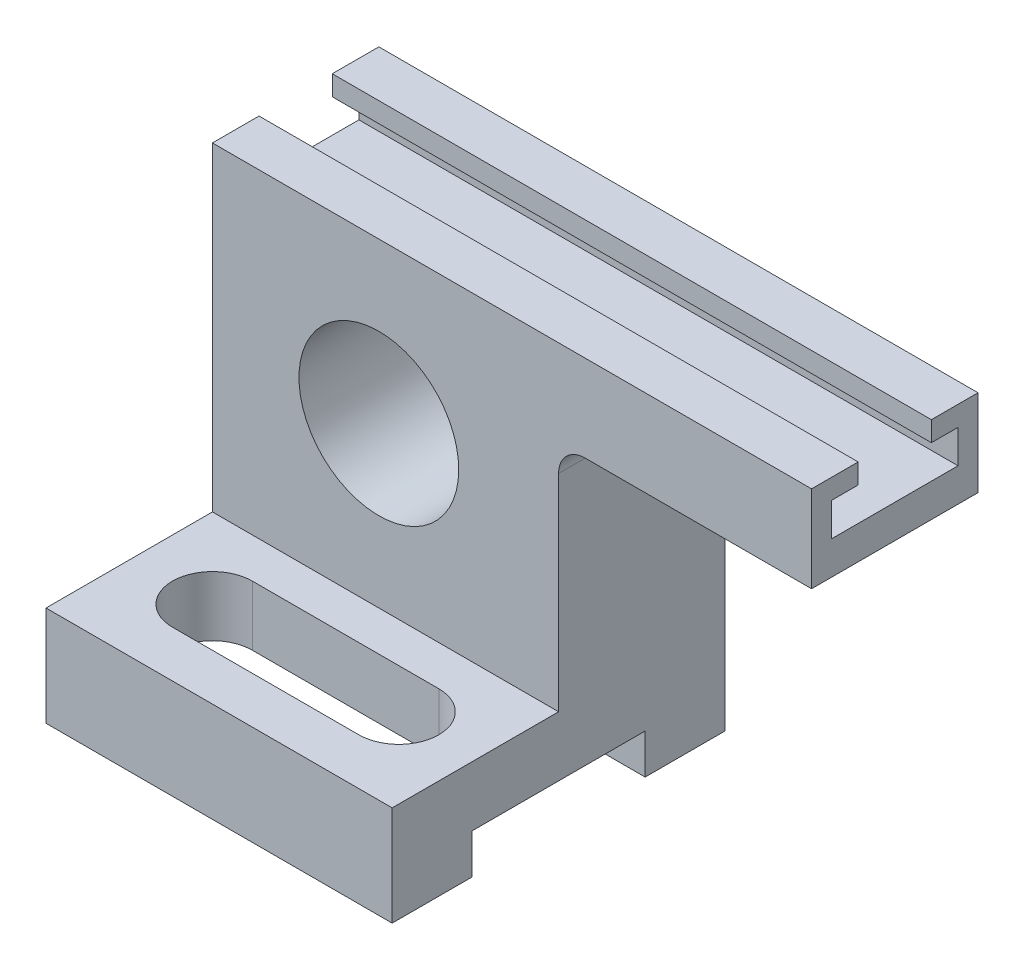
ISO-10303-21;
HEADER;
FILE_DESCRIPTION(('STEP AP214'),'2;1');
FILE_NAME('part.step','',(''),(''),'','','');
FILE_SCHEMA(('AUTOMOTIVE_DESIGN { 1 0 10303 214 1 1 1 1 }'));
ENDSEC;
DATA;
#1=APPLICATION_CONTEXT('core data for automotive mechanical design processes');
#2=APPLICATION_PROTOCOL_DEFINITION('international standard','automotive_design',2000,#1);
#3=PRODUCT_CONTEXT('',#1,'mechanical');
#4=PRODUCT('Part','Part','',(#3));
#5=PRODUCT_RELATED_PRODUCT_CATEGORY('part','',(#4));
#6=PRODUCT_DEFINITION_FORMATION('','',#4);
#7=PRODUCT_DEFINITION_CONTEXT('part definition',#1,'design');
#8=PRODUCT_DEFINITION('design','',#6,#7);
#9=PRODUCT_DEFINITION_SHAPE('','',#8);
#10=(LENGTH_UNIT() NAMED_UNIT(*) SI_UNIT(.MILLI.,.METRE.));
#11=(NAMED_UNIT(*) PLANE_ANGLE_UNIT() SI_UNIT($,.RADIAN.));
#12=(NAMED_UNIT(*) SI_UNIT($,.STERADIAN.) SOLID_ANGLE_UNIT());
#13=UNCERTAINTY_MEASURE_WITH_UNIT(LENGTH_MEASURE(1.E-05),#10,'distance_accuracy_value','');
#14=(GEOMETRIC_REPRESENTATION_CONTEXT(3) GLOBAL_UNCERTAINTY_ASSIGNED_CONTEXT((#13)) GLOBAL_UNIT_ASSIGNED_CONTEXT((#10,
#11,#12)) REPRESENTATION_CONTEXT('',''));
#15=CARTESIAN_POINT('',(0.,0.,0.));
#16=DIRECTION('',(0.,0.,1.));
#17=DIRECTION('',(1.,0.,0.));
#18=AXIS2_PLACEMENT_3D('',#15,#16,#17);
#19=CARTESIAN_POINT('',(0.,30.,100.));
#20=DIRECTION('',(0.,1.,0.));
#21=DIRECTION('',(0.,0.,1.));
#22=AXIS2_PLACEMENT_3D('',#19,#20,#21);
#23=PLANE('',#22);
#24=DIRECTION('',(1.,0.,0.));
#25=VECTOR('',#24,1.);
#26=CARTESIAN_POINT('',(0.,30.,50.));
#27=LINE('',#26,#25);
#28=CARTESIAN_POINT('',(0.,30.,50.));
#29=VERTEX_POINT('',#28);
#30=CARTESIAN_POINT('',(104.,30.,50.));
#31=VERTEX_POINT('',#30);
#32=EDGE_CURVE('E370',#29,#31,#27,.T.);
#33=ORIENTED_EDGE('',*,*,#32,.F.);
#34=DIRECTION('',(0.,0.,-1.));
#35=VECTOR('',#34,1.);
#36=CARTESIAN_POINT('',(0.,30.,100.));
#37=LINE('',#36,#35);
#38=CARTESIAN_POINT('',(0.,30.,100.));
#39=VERTEX_POINT('',#38);
#40=EDGE_CURVE('E363',#39,#29,#37,.T.);
#41=ORIENTED_EDGE('',*,*,#40,.F.);
#42=DIRECTION('',(1.,0.,0.));
#43=VECTOR('',#42,1.);
#44=CARTESIAN_POINT('',(0.,30.,100.));
#45=LINE('',#44,#43);
#46=CARTESIAN_POINT('',(104.,30.,100.));
#47=VERTEX_POINT('',#46);
#48=EDGE_CURVE('E342',#39,#47,#45,.T.);
#49=ORIENTED_EDGE('',*,*,#48,.T.);
#50=DIRECTION('',(0.,0.,-1.));
#51=VECTOR('',#50,1.);
#52=CARTESIAN_POINT('',(104.,30.,100.));
#53=LINE('',#52,#51);
#54=EDGE_CURVE('E351',#47,#31,#53,.T.);
#55=ORIENTED_EDGE('',*,*,#54,.T.);
#56=EDGE_LOOP('',(#33,#41,#49,#55));
#57=FACE_BOUND('',#56,.T.);
#58=CARTESIAN_POINT('',(24.,30.,74.));
#59=DIRECTION('',(0.,1.,0.));
#60=DIRECTION('',(0.,0.,1.));
#61=AXIS2_PLACEMENT_3D('',#58,#59,#60);
#62=CIRCLE('',#61,12.);
#63=CARTESIAN_POINT('',(24.,30.,62.));
#64=VERTEX_POINT('',#63);
#65=CARTESIAN_POINT('',(24.,30.,86.));
#66=VERTEX_POINT('',#65);
#67=EDGE_CURVE('E233',#64,#66,#62,.T.);
#68=ORIENTED_EDGE('',*,*,#67,.F.);
#69=DIRECTION('',(1.,0.,0.));
#70=VECTOR('',#69,1.);
#71=CARTESIAN_POINT('',(24.,30.,62.));
#72=LINE('',#71,#70);
#73=CARTESIAN_POINT('',(80.,30.,62.));
#74=VERTEX_POINT('',#73);
#75=EDGE_CURVE('E243',#64,#74,#72,.T.);
#76=ORIENTED_EDGE('',*,*,#75,.T.);
#77=CARTESIAN_POINT('',(80.,30.,74.));
#78=DIRECTION('',(0.,1.,0.));
#79=DIRECTION('',(0.,0.,1.));
#80=AXIS2_PLACEMENT_3D('',#77,#78,#79);
#81=CIRCLE('',#80,12.);
#82=CARTESIAN_POINT('',(80.,30.,86.));
#83=VERTEX_POINT('',#82);
#84=EDGE_CURVE('E246',#83,#74,#81,.T.);
#85=ORIENTED_EDGE('',*,*,#84,.F.);
#86=DIRECTION('',(1.,0.,0.));
#87=VECTOR('',#86,1.);
#88=CARTESIAN_POINT('',(24.,30.,86.));
#89=LINE('',#88,#87);
#90=EDGE_CURVE('E219',#66,#83,#89,.T.);
#91=ORIENTED_EDGE('',*,*,#90,.F.);
#92=EDGE_LOOP('',(#68,#76,#85,#91));
#93=FACE_BOUND('',#92,.T.);
#94=ADVANCED_FACE('F33',(#57,#93),#23,.T.);
#95=CARTESIAN_POINT('',(0.,0.,76.));
#96=DIRECTION('',(0.,0.,-1.));
#97=DIRECTION('',(-1.,0.,0.));
#98=AXIS2_PLACEMENT_3D('',#95,#96,#97);
#99=PLANE('',#98);
#100=DIRECTION('',(0.,1.,0.));
#101=VECTOR('',#100,1.);
#102=CARTESIAN_POINT('',(91.8321595661992,0.,76.));
#103=LINE('',#102,#101);
#104=CARTESIAN_POINT('',(91.8321595661992,12.,76.));
#105=VERTEX_POINT('',#104);
#106=CARTESIAN_POINT('',(91.8321595661993,0.,76.));
#107=VERTEX_POINT('',#106);
#108=EDGE_CURVE('E230',#105,#107,#103,.F.);
#109=ORIENTED_EDGE('',*,*,#108,.F.);
#110=DIRECTION('',(1.,0.,0.));
#111=VECTOR('',#110,1.);
#112=CARTESIAN_POINT('',(0.,12.,76.));
#113=LINE('',#112,#111);
#114=CARTESIAN_POINT('',(104.,12.,76.));
#115=VERTEX_POINT('',#114);
#116=EDGE_CURVE('E332',#105,#115,#113,.T.);
#117=ORIENTED_EDGE('',*,*,#116,.T.);
#118=DIRECTION('',(0.,-1.,0.));
#119=VECTOR('',#118,1.);
#120=CARTESIAN_POINT('',(104.,0.,76.));
#121=LINE('',#120,#119);
#122=CARTESIAN_POINT('',(104.,0.,76.));
#123=VERTEX_POINT('',#122);
#124=EDGE_CURVE('E338',#115,#123,#121,.T.);
#125=ORIENTED_EDGE('',*,*,#124,.T.);
#126=DIRECTION('',(1.,0.,0.));
#127=VECTOR('',#126,1.);
#128=CARTESIAN_POINT('',(0.,0.,76.));
#129=LINE('',#128,#127);
#130=EDGE_CURVE('E324',#107,#123,#129,.T.);
#131=ORIENTED_EDGE('',*,*,#130,.F.);
#132=EDGE_LOOP('',(#109,#117,#125,#131));
#133=FACE_BOUND('',#132,.T.);
#134=ADVANCED_FACE('F448',(#133),#99,.T.);
#135=CARTESIAN_POINT('',(0.,126.,50.));
#136=DIRECTION('',(0.,-1.,0.));
#137=DIRECTION('',(1.,0.,0.));
#138=AXIS2_PLACEMENT_3D('',#135,#136,#137);
#139=PLANE('',#138);
#140=DIRECTION('',(0.,0.,-1.));
#141=VECTOR('',#140,1.);
#142=CARTESIAN_POINT('',(180.,126.,50.));
#143=LINE('',#142,#141);
#144=CARTESIAN_POINT('',(180.,126.,50.));
#145=VERTEX_POINT('',#144);
#146=CARTESIAN_POINT('',(180.,126.,36.));
#147=VERTEX_POINT('',#146);
#148=EDGE_CURVE('E398',#145,#147,#143,.T.);
#149=ORIENTED_EDGE('',*,*,#148,.T.);
#150=DIRECTION('',(1.,0.,0.));
#151=VECTOR('',#150,1.);
#152=CARTESIAN_POINT('',(0.,126.,36.));
#153=LINE('',#152,#151);
#154=CARTESIAN_POINT('',(0.,126.,36.));
#155=VERTEX_POINT('',#154);
#156=EDGE_CURVE('E307',#155,#147,#153,.T.);
#157=ORIENTED_EDGE('',*,*,#156,.F.);
#158=DIRECTION('',(0.,0.,-1.));
#159=VECTOR('',#158,1.);
#160=CARTESIAN_POINT('',(0.,126.,50.));
#161=LINE('',#160,#159);
#162=CARTESIAN_POINT('',(0.,126.,50.));
#163=VERTEX_POINT('',#162);
#164=EDGE_CURVE('E394',#163,#155,#161,.T.);
#165=ORIENTED_EDGE('',*,*,#164,.F.);
#166=DIRECTION('',(-1.,0.,0.));
#167=VECTOR('',#166,1.);
#168=CARTESIAN_POINT('',(0.,126.,50.));
#169=LINE('',#168,#167);
#170=EDGE_CURVE('E380',#145,#163,#169,.T.);
#171=ORIENTED_EDGE('',*,*,#170,.F.);
#172=EDGE_LOOP('',(#149,#157,#165,#171));
#173=FACE_BOUND('',#172,.T.);
#174=ADVANCED_FACE('F454',(#173),#139,.F.);
#175=CARTESIAN_POINT('',(0.,0.,50.));
#176=DIRECTION('',(1.,0.,0.));
#177=DIRECTION('',(0.,1.,0.));
#178=AXIS2_PLACEMENT_3D('',#175,#176,#177);
#179=PLANE('',#178);
#180=ORIENTED_EDGE('',*,*,#164,.T.);
#181=DIRECTION('',(0.,-1.,0.));
#182=VECTOR('',#181,1.);
#183=CARTESIAN_POINT('',(0.,126.,36.));
#184=LINE('',#183,#182);
#185=CARTESIAN_POINT('',(0.,120.,36.));
#186=VERTEX_POINT('',#185);
#187=EDGE_CURVE('E277',#155,#186,#184,.T.);
#188=ORIENTED_EDGE('',*,*,#187,.T.);
#189=DIRECTION('',(0.,0.,1.));
#190=VECTOR('',#189,1.);
#191=CARTESIAN_POINT('',(0.,120.,36.));
#192=LINE('',#191,#190);
#193=CARTESIAN_POINT('',(0.,120.,44.));
#194=VERTEX_POINT('',#193);
#195=EDGE_CURVE('E280',#186,#194,#192,.T.);
#196=ORIENTED_EDGE('',*,*,#195,.T.);
#197=DIRECTION('',(0.,-1.,0.));
#198=VECTOR('',#197,1.);
#199=CARTESIAN_POINT('',(0.,120.,44.));
#200=LINE('',#199,#198);
#201=CARTESIAN_POINT('',(0.,110.,44.));
#202=VERTEX_POINT('',#201);
#203=EDGE_CURVE('E261',#194,#202,#200,.T.);
#204=ORIENTED_EDGE('',*,*,#203,.T.);
#205=DIRECTION('',(0.,0.,-1.));
#206=VECTOR('',#205,1.);
#207=CARTESIAN_POINT('',(0.,110.,44.));
#208=LINE('',#207,#206);
#209=CARTESIAN_POINT('',(0.,110.,6.));
#210=VERTEX_POINT('',#209);
#211=EDGE_CURVE('E264',#202,#210,#208,.T.);
#212=ORIENTED_EDGE('',*,*,#211,.T.);
#213=DIRECTION('',(0.,1.,0.));
#214=VECTOR('',#213,1.);
#215=CARTESIAN_POINT('',(0.,110.,6.));
#216=LINE('',#215,#214);
#217=CARTESIAN_POINT('',(0.,120.,6.));
#218=VERTEX_POINT('',#217);
#219=EDGE_CURVE('E268',#210,#218,#216,.T.);
#220=ORIENTED_EDGE('',*,*,#219,.T.);
#221=DIRECTION('',(0.,0.,1.));
#222=VECTOR('',#221,1.);
#223=CARTESIAN_POINT('',(0.,120.,6.));
#224=LINE('',#223,#222);
#225=CARTESIAN_POINT('',(0.,120.,14.));
#226=VERTEX_POINT('',#225);
#227=EDGE_CURVE('E271',#218,#226,#224,.T.);
#228=ORIENTED_EDGE('',*,*,#227,.T.);
#229=DIRECTION('',(0.,1.,0.));
#230=VECTOR('',#229,1.);
#231=CARTESIAN_POINT('',(0.,120.,14.));
#232=LINE('',#231,#230);
#233=CARTESIAN_POINT('',(0.,126.,14.));
#234=VERTEX_POINT('',#233);
#235=EDGE_CURVE('E274',#226,#234,#232,.T.);
#236=ORIENTED_EDGE('',*,*,#235,.T.);
#237=CARTESIAN_POINT('',(0.,126.,0.));
#238=VERTEX_POINT('',#237);
#239=EDGE_CURVE('E382',#234,#238,#161,.T.);
#240=ORIENTED_EDGE('',*,*,#239,.T.);
#241=DIRECTION('',(0.,-1.,0.));
#242=VECTOR('',#241,1.);
#243=CARTESIAN_POINT('',(0.,0.,0.));
#244=LINE('',#243,#242);
#245=CARTESIAN_POINT('',(0.,0.,0.));
#246=VERTEX_POINT('',#245);
#247=EDGE_CURVE('E366',#238,#246,#244,.T.);
#248=ORIENTED_EDGE('',*,*,#247,.T.);
#249=DIRECTION('',(0.,0.,-1.));
#250=VECTOR('',#249,1.);
#251=CARTESIAN_POINT('',(0.,0.,100.));
#252=LINE('',#251,#250);
#253=CARTESIAN_POINT('',(0.,0.,24.));
#254=VERTEX_POINT('',#253);
#255=EDGE_CURVE('E359',#254,#246,#252,.T.);
#256=ORIENTED_EDGE('',*,*,#255,.F.);
#257=DIRECTION('',(0.,-1.,0.));
#258=VECTOR('',#257,1.);
#259=CARTESIAN_POINT('',(0.,12.,24.));
#260=LINE('',#259,#258);
#261=CARTESIAN_POINT('',(0.,12.,24.));
#262=VERTEX_POINT('',#261);
#263=EDGE_CURVE('E322',#262,#254,#260,.T.);
#264=ORIENTED_EDGE('',*,*,#263,.F.);
#265=DIRECTION('',(0.,0.,-1.));
#266=VECTOR('',#265,1.);
#267=CARTESIAN_POINT('',(0.,12.,76.));
#268=LINE('',#267,#266);
#269=CARTESIAN_POINT('',(0.,12.,76.));
#270=VERTEX_POINT('',#269);
#271=EDGE_CURVE('E320',#270,#262,#268,.T.);
#272=ORIENTED_EDGE('',*,*,#271,.F.);
#273=DIRECTION('',(0.,1.,0.));
#274=VECTOR('',#273,1.);
#275=CARTESIAN_POINT('',(0.,0.,76.));
#276=LINE('',#275,#274);
#277=CARTESIAN_POINT('',(0.,0.,76.));
#278=VERTEX_POINT('',#277);
#279=EDGE_CURVE('E304',#278,#270,#276,.T.);
#280=ORIENTED_EDGE('',*,*,#279,.F.);
#281=CARTESIAN_POINT('',(0.,0.,100.));
#282=VERTEX_POINT('',#281);
#283=EDGE_CURVE('E360',#282,#278,#252,.T.);
#284=ORIENTED_EDGE('',*,*,#283,.F.);
#285=DIRECTION('',(0.,-1.,0.));
#286=VECTOR('',#285,1.);
#287=CARTESIAN_POINT('',(0.,0.,100.));
#288=LINE('',#287,#286);
#289=EDGE_CURVE('E345',#39,#282,#288,.T.);
#290=ORIENTED_EDGE('',*,*,#289,.F.);
#291=ORIENTED_EDGE('',*,*,#40,.T.);
#292=DIRECTION('',(0.,-1.,0.));
#293=VECTOR('',#292,1.);
#294=CARTESIAN_POINT('',(0.,0.,50.));
#295=LINE('',#294,#293);
#296=EDGE_CURVE('E367',#163,#29,#295,.T.);
#297=ORIENTED_EDGE('',*,*,#296,.F.);
#298=EDGE_LOOP('',(#180,#188,#196,#204,#212,#220,#228,#236,#240,#248,#256,#264,#272,#280,#284,
#290,#291,#297));
#299=FACE_BOUND('',#298,.T.);
#300=ADVANCED_FACE('F480',(#299),#179,.F.);
#301=CARTESIAN_POINT('',(104.,0.,50.));
#302=DIRECTION('',(-1.,0.,0.));
#303=DIRECTION('',(0.,0.,1.));
#304=AXIS2_PLACEMENT_3D('',#301,#302,#303);
#305=PLANE('',#304);
#306=DIRECTION('',(0.,1.,0.));
#307=VECTOR('',#306,1.);
#308=CARTESIAN_POINT('',(104.,0.,0.));
#309=LINE('',#308,#307);
#310=CARTESIAN_POINT('',(104.,0.,0.));
#311=VERTEX_POINT('',#310);
#312=CARTESIAN_POINT('',(104.,92.,0.));
#313=VERTEX_POINT('',#312);
#314=EDGE_CURVE('E385',#311,#313,#309,.T.);
#315=ORIENTED_EDGE('',*,*,#314,.T.);
#316=DIRECTION('',(0.,0.,-1.));
#317=VECTOR('',#316,1.);
#318=CARTESIAN_POINT('',(104.,92.,50.));
#319=LINE('',#318,#317);
#320=CARTESIAN_POINT('',(104.,92.,50.));
#321=VERTEX_POINT('',#320);
#322=EDGE_CURVE('E48',#313,#321,#319,.F.);
#323=ORIENTED_EDGE('',*,*,#322,.T.);
#324=DIRECTION('',(0.,1.,0.));
#325=VECTOR('',#324,1.);
#326=CARTESIAN_POINT('',(104.,0.,50.));
#327=LINE('',#326,#325);
#328=EDGE_CURVE('E374',#31,#321,#327,.T.);
#329=ORIENTED_EDGE('',*,*,#328,.F.);
#330=ORIENTED_EDGE('',*,*,#54,.F.);
#331=DIRECTION('',(0.,1.,0.));
#332=VECTOR('',#331,1.);
#333=CARTESIAN_POINT('',(104.,0.,100.));
#334=LINE('',#333,#332);
#335=CARTESIAN_POINT('',(104.,0.,100.));
#336=VERTEX_POINT('',#335);
#337=EDGE_CURVE('E349',#336,#47,#334,.T.);
#338=ORIENTED_EDGE('',*,*,#337,.F.);
#339=DIRECTION('',(0.,0.,-1.));
#340=VECTOR('',#339,1.);
#341=CARTESIAN_POINT('',(104.,0.,100.));
#342=LINE('',#341,#340);
#343=EDGE_CURVE('E356',#336,#123,#342,.T.);
#344=ORIENTED_EDGE('',*,*,#343,.T.);
#345=ORIENTED_EDGE('',*,*,#124,.F.);
#346=DIRECTION('',(0.,0.,1.));
#347=VECTOR('',#346,1.);
#348=CARTESIAN_POINT('',(104.,12.,50.));
#349=LINE('',#348,#347);
#350=CARTESIAN_POINT('',(104.,12.,24.));
#351=VERTEX_POINT('',#350);
#352=EDGE_CURVE('E404',#351,#115,#349,.T.);
#353=ORIENTED_EDGE('',*,*,#352,.F.);
#354=DIRECTION('',(0.,1.,0.));
#355=VECTOR('',#354,1.);
#356=CARTESIAN_POINT('',(104.,0.,24.));
#357=LINE('',#356,#355);
#358=CARTESIAN_POINT('',(104.,0.,24.));
#359=VERTEX_POINT('',#358);
#360=EDGE_CURVE('E336',#359,#351,#357,.T.);
#361=ORIENTED_EDGE('',*,*,#360,.F.);
#362=EDGE_CURVE('E355',#359,#311,#342,.T.);
#363=ORIENTED_EDGE('',*,*,#362,.T.);
#364=EDGE_LOOP('',(#315,#323,#329,#330,#338,#344,#345,#353,#361,#363));
#365=FACE_BOUND('',#364,.T.);
#366=ADVANCED_FACE('F478',(#365),#305,.F.);
#367=CARTESIAN_POINT('',(0.,0.,100.));
#368=DIRECTION('',(0.,1.,0.));
#369=DIRECTION('',(0.,0.,1.));
#370=AXIS2_PLACEMENT_3D('',#367,#368,#369);
#371=PLANE('',#370);
#372=DIRECTION('',(1.,0.,0.));
#373=VECTOR('',#372,1.);
#374=CARTESIAN_POINT('',(24.,0.,86.));
#375=LINE('',#374,#373);
#376=CARTESIAN_POINT('',(24.,0.,86.));
#377=VERTEX_POINT('',#376);
#378=CARTESIAN_POINT('',(80.,0.,86.));
#379=VERTEX_POINT('',#378);
#380=EDGE_CURVE('E216',#377,#379,#375,.T.);
#381=ORIENTED_EDGE('',*,*,#380,.T.);
#382=CARTESIAN_POINT('',(80.,0.,74.));
#383=DIRECTION('',(0.,1.,0.));
#384=DIRECTION('',(0.,0.,1.));
#385=AXIS2_PLACEMENT_3D('',#382,#383,#384);
#386=CIRCLE('',#385,12.);
#387=EDGE_CURVE('E227',#379,#107,#386,.T.);
#388=ORIENTED_EDGE('',*,*,#387,.T.);
#389=ORIENTED_EDGE('',*,*,#130,.T.);
#390=ORIENTED_EDGE('',*,*,#343,.F.);
#391=DIRECTION('',(1.,0.,0.));
#392=VECTOR('',#391,1.);
#393=CARTESIAN_POINT('',(0.,0.,100.));
#394=LINE('',#393,#392);
#395=EDGE_CURVE('E347',#282,#336,#394,.T.);
#396=ORIENTED_EDGE('',*,*,#395,.F.);
#397=ORIENTED_EDGE('',*,*,#283,.T.);
#398=CARTESIAN_POINT('',(12.1678404338008,0.,76.));
#399=VERTEX_POINT('',#398);
#400=EDGE_CURVE('E325',#278,#399,#129,.T.);
#401=ORIENTED_EDGE('',*,*,#400,.T.);
#402=CARTESIAN_POINT('',(24.,0.,74.));
#403=DIRECTION('',(0.,1.,0.));
#404=DIRECTION('',(0.,0.,1.));
#405=AXIS2_PLACEMENT_3D('',#402,#403,#404);
#406=CIRCLE('',#405,12.);
#407=EDGE_CURVE('E237',#399,#377,#406,.T.);
#408=ORIENTED_EDGE('',*,*,#407,.T.);
#409=EDGE_LOOP('',(#381,#388,#389,#390,#396,#397,#401,#408));
#410=FACE_BOUND('',#409,.T.);
#411=ADVANCED_FACE('F235',(#410),#371,.F.);
#412=DIRECTION('',(1.,0.,0.));
#413=VECTOR('',#412,1.);
#414=CARTESIAN_POINT('',(0.,0.,24.));
#415=LINE('',#414,#413);
#416=EDGE_CURVE('E327',#254,#359,#415,.T.);
#417=ORIENTED_EDGE('',*,*,#416,.F.);
#418=ORIENTED_EDGE('',*,*,#255,.T.);
#419=DIRECTION('',(1.,0.,0.));
#420=VECTOR('',#419,1.);
#421=CARTESIAN_POINT('',(0.,0.,0.));
#422=LINE('',#421,#420);
#423=EDGE_CURVE('E341',#246,#311,#422,.T.);
#424=ORIENTED_EDGE('',*,*,#423,.T.);
#425=ORIENTED_EDGE('',*,*,#362,.F.);
#426=EDGE_LOOP('',(#417,#418,#424,#425));
#427=FACE_BOUND('',#426,.T.);
#428=ADVANCED_FACE('F477',(#427),#371,.F.);
#429=CARTESIAN_POINT('',(0.,100.,50.));
#430=DIRECTION('',(0.,1.,0.));
#431=DIRECTION('',(0.,0.,1.));
#432=AXIS2_PLACEMENT_3D('',#429,#430,#431);
#433=PLANE('',#432);
#434=DIRECTION('',(1.,0.,0.));
#435=VECTOR('',#434,1.);
#436=CARTESIAN_POINT('',(0.,100.,50.));
#437=LINE('',#436,#435);
#438=CARTESIAN_POINT('',(112.,100.,50.));
#439=VERTEX_POINT('',#438);
#440=CARTESIAN_POINT('',(180.,100.,50.));
#441=VERTEX_POINT('',#440);
#442=EDGE_CURVE('E376',#439,#441,#437,.T.);
#443=ORIENTED_EDGE('',*,*,#442,.F.);
#444=DIRECTION('',(0.,0.,-1.));
#445=VECTOR('',#444,1.);
#446=CARTESIAN_POINT('',(112.,100.,0.));
#447=LINE('',#446,#445);
#448=CARTESIAN_POINT('',(112.,100.,0.));
#449=VERTEX_POINT('',#448);
#450=EDGE_CURVE('E413',#439,#449,#447,.T.);
#451=ORIENTED_EDGE('',*,*,#450,.T.);
#452=DIRECTION('',(1.,0.,0.));
#453=VECTOR('',#452,1.);
#454=CARTESIAN_POINT('',(0.,100.,0.));
#455=LINE('',#454,#453);
#456=CARTESIAN_POINT('',(180.,100.,0.));
#457=VERTEX_POINT('',#456);
#458=EDGE_CURVE('E387',#449,#457,#455,.T.);
#459=ORIENTED_EDGE('',*,*,#458,.T.);
#460=DIRECTION('',(0.,0.,-1.));
#461=VECTOR('',#460,1.);
#462=CARTESIAN_POINT('',(180.,100.,50.));
#463=LINE('',#462,#461);
#464=EDGE_CURVE('E401',#441,#457,#463,.T.);
#465=ORIENTED_EDGE('',*,*,#464,.F.);
#466=EDGE_LOOP('',(#443,#451,#459,#465));
#467=FACE_BOUND('',#466,.T.);
#468=ADVANCED_FACE('F419',(#467),#433,.F.);
#469=CARTESIAN_POINT('',(180.,0.,50.));
#470=DIRECTION('',(-1.,0.,0.));
#471=DIRECTION('',(0.,0.,1.));
#472=AXIS2_PLACEMENT_3D('',#469,#470,#471);
#473=PLANE('',#472);
#474=DIRECTION('',(0.,0.,1.));
#475=VECTOR('',#474,1.);
#476=CARTESIAN_POINT('',(180.,120.,36.));
#477=LINE('',#476,#475);
#478=CARTESIAN_POINT('',(180.,120.,36.));
#479=VERTEX_POINT('',#478);
#480=CARTESIAN_POINT('',(180.,120.,44.));
#481=VERTEX_POINT('',#480);
#482=EDGE_CURVE('E265',#479,#481,#477,.T.);
#483=ORIENTED_EDGE('',*,*,#482,.F.);
#484=DIRECTION('',(0.,-1.,0.));
#485=VECTOR('',#484,1.);
#486=CARTESIAN_POINT('',(180.,126.,36.));
#487=LINE('',#486,#485);
#488=EDGE_CURVE('E297',#147,#479,#487,.T.);
#489=ORIENTED_EDGE('',*,*,#488,.F.);
#490=ORIENTED_EDGE('',*,*,#148,.F.);
#491=DIRECTION('',(0.,1.,0.));
#492=VECTOR('',#491,1.);
#493=CARTESIAN_POINT('',(180.,0.,50.));
#494=LINE('',#493,#492);
#495=EDGE_CURVE('E378',#441,#145,#494,.T.);
#496=ORIENTED_EDGE('',*,*,#495,.F.);
#497=ORIENTED_EDGE('',*,*,#464,.T.);
#498=DIRECTION('',(0.,1.,0.));
#499=VECTOR('',#498,1.);
#500=CARTESIAN_POINT('',(180.,0.,0.));
#501=LINE('',#500,#499);
#502=CARTESIAN_POINT('',(180.,126.,0.));
#503=VERTEX_POINT('',#502);
#504=EDGE_CURVE('E389',#457,#503,#501,.T.);
#505=ORIENTED_EDGE('',*,*,#504,.T.);
#506=CARTESIAN_POINT('',(180.,126.,14.));
#507=VERTEX_POINT('',#506);
#508=EDGE_CURVE('E397',#507,#503,#143,.T.);
#509=ORIENTED_EDGE('',*,*,#508,.F.);
#510=DIRECTION('',(0.,1.,0.));
#511=VECTOR('',#510,1.);
#512=CARTESIAN_POINT('',(180.,120.,14.));
#513=LINE('',#512,#511);
#514=CARTESIAN_POINT('',(180.,120.,14.));
#515=VERTEX_POINT('',#514);
#516=EDGE_CURVE('E295',#515,#507,#513,.T.);
#517=ORIENTED_EDGE('',*,*,#516,.F.);
#518=DIRECTION('',(0.,0.,1.));
#519=VECTOR('',#518,1.);
#520=CARTESIAN_POINT('',(180.,120.,6.));
#521=LINE('',#520,#519);
#522=CARTESIAN_POINT('',(180.,120.,6.));
#523=VERTEX_POINT('',#522);
#524=EDGE_CURVE('E292',#523,#515,#521,.T.);
#525=ORIENTED_EDGE('',*,*,#524,.F.);
#526=DIRECTION('',(0.,1.,0.));
#527=VECTOR('',#526,1.);
#528=CARTESIAN_POINT('',(180.,110.,6.));
#529=LINE('',#528,#527);
#530=CARTESIAN_POINT('',(180.,110.,6.));
#531=VERTEX_POINT('',#530);
#532=EDGE_CURVE('E289',#531,#523,#529,.T.);
#533=ORIENTED_EDGE('',*,*,#532,.F.);
#534=DIRECTION('',(0.,0.,-1.));
#535=VECTOR('',#534,1.);
#536=CARTESIAN_POINT('',(180.,110.,44.));
#537=LINE('',#536,#535);
#538=CARTESIAN_POINT('',(180.,110.,44.));
#539=VERTEX_POINT('',#538);
#540=EDGE_CURVE('E286',#539,#531,#537,.T.);
#541=ORIENTED_EDGE('',*,*,#540,.F.);
#542=DIRECTION('',(0.,-1.,0.));
#543=VECTOR('',#542,1.);
#544=CARTESIAN_POINT('',(180.,120.,44.));
#545=LINE('',#544,#543);
#546=EDGE_CURVE('E260',#481,#539,#545,.T.);
#547=ORIENTED_EDGE('',*,*,#546,.F.);
#548=EDGE_LOOP('',(#483,#489,#490,#496,#497,#505,#509,#517,#525,#533,#541,#547));
#549=FACE_BOUND('',#548,.T.);
#550=ADVANCED_FACE('F430',(#549),#473,.F.);
#551=ORIENTED_EDGE('',*,*,#239,.F.);
#552=DIRECTION('',(1.,0.,0.));
#553=VECTOR('',#552,1.);
#554=CARTESIAN_POINT('',(0.,126.,14.));
#555=LINE('',#554,#553);
#556=EDGE_CURVE('E309',#234,#507,#555,.T.);
#557=ORIENTED_EDGE('',*,*,#556,.T.);
#558=ORIENTED_EDGE('',*,*,#508,.T.);
#559=DIRECTION('',(-1.,0.,0.));
#560=VECTOR('',#559,1.);
#561=CARTESIAN_POINT('',(0.,126.,0.));
#562=LINE('',#561,#560);
#563=EDGE_CURVE('E371',#503,#238,#562,.T.);
#564=ORIENTED_EDGE('',*,*,#563,.T.);
#565=EDGE_LOOP('',(#551,#557,#558,#564));
#566=FACE_BOUND('',#565,.T.);
#567=ADVANCED_FACE('F464',(#566),#139,.F.);
#568=CARTESIAN_POINT('',(0.,0.,50.));
#569=DIRECTION('',(0.,0.,1.));
#570=DIRECTION('',(1.,0.,0.));
#571=AXIS2_PLACEMENT_3D('',#568,#569,#570);
#572=PLANE('',#571);
#573=CARTESIAN_POINT('',(50.,78.,50.));
#574=DIRECTION('',(0.,0.,1.));
#575=DIRECTION('',(1.,0.,0.));
#576=AXIS2_PLACEMENT_3D('',#573,#574,#575);
#577=CIRCLE('',#576,24.);
#578=CARTESIAN_POINT('',(74.,78.,50.));
#579=VERTEX_POINT('',#578);
#580=EDGE_CURVE('E759',#579,#579,#577,.T.);
#581=ORIENTED_EDGE('',*,*,#580,.F.);
#582=EDGE_LOOP('',(#581));
#583=FACE_BOUND('',#582,.T.);
#584=ORIENTED_EDGE('',*,*,#296,.T.);
#585=ORIENTED_EDGE('',*,*,#32,.T.);
#586=ORIENTED_EDGE('',*,*,#328,.T.);
#587=CARTESIAN_POINT('',(112.,92.,50.));
#588=DIRECTION('',(0.,0.,1.));
#589=DIRECTION('',(1.,0.,0.));
#590=AXIS2_PLACEMENT_3D('',#587,#588,#589);
#591=CIRCLE('',#590,8.);
#592=EDGE_CURVE('E11',#321,#439,#591,.F.);
#593=ORIENTED_EDGE('',*,*,#592,.T.);
#594=ORIENTED_EDGE('',*,*,#442,.T.);
#595=ORIENTED_EDGE('',*,*,#495,.T.);
#596=ORIENTED_EDGE('',*,*,#170,.T.);
#597=EDGE_LOOP('',(#584,#585,#586,#593,#594,#595,#596));
#598=FACE_BOUND('',#597,.T.);
#599=ADVANCED_FACE('F437',(#583,#598),#572,.T.);
#600=CARTESIAN_POINT('',(0.,0.,0.));
#601=DIRECTION('',(0.,0.,1.));
#602=DIRECTION('',(1.,0.,0.));
#603=AXIS2_PLACEMENT_3D('',#600,#601,#602);
#604=PLANE('',#603);
#605=CARTESIAN_POINT('',(50.,78.,0.));
#606=DIRECTION('',(0.,0.,1.));
#607=DIRECTION('',(1.,0.,0.));
#608=AXIS2_PLACEMENT_3D('',#605,#606,#607);
#609=CIRCLE('',#608,24.);
#610=CARTESIAN_POINT('',(74.,78.,0.));
#611=VERTEX_POINT('',#610);
#612=EDGE_CURVE('E247',#611,#611,#609,.T.);
#613=ORIENTED_EDGE('',*,*,#612,.T.);
#614=EDGE_LOOP('',(#613));
#615=FACE_BOUND('',#614,.T.);
#616=ORIENTED_EDGE('',*,*,#247,.F.);
#617=ORIENTED_EDGE('',*,*,#563,.F.);
#618=ORIENTED_EDGE('',*,*,#504,.F.);
#619=ORIENTED_EDGE('',*,*,#458,.F.);
#620=CARTESIAN_POINT('',(112.,92.,0.));
#621=DIRECTION('',(0.,0.,1.));
#622=DIRECTION('',(1.,0.,0.));
#623=AXIS2_PLACEMENT_3D('',#620,#621,#622);
#624=CIRCLE('',#623,8.);
#625=EDGE_CURVE('E41',#449,#313,#624,.T.);
#626=ORIENTED_EDGE('',*,*,#625,.T.);
#627=ORIENTED_EDGE('',*,*,#314,.F.);
#628=ORIENTED_EDGE('',*,*,#423,.F.);
#629=EDGE_LOOP('',(#616,#617,#618,#619,#626,#627,#628));
#630=FACE_BOUND('',#629,.T.);
#631=ADVANCED_FACE('F425',(#615,#630),#604,.F.);
#632=CARTESIAN_POINT('',(0.,0.,100.));
#633=DIRECTION('',(0.,0.,1.));
#634=DIRECTION('',(1.,0.,0.));
#635=AXIS2_PLACEMENT_3D('',#632,#633,#634);
#636=PLANE('',#635);
#637=ORIENTED_EDGE('',*,*,#48,.F.);
#638=ORIENTED_EDGE('',*,*,#289,.T.);
#639=ORIENTED_EDGE('',*,*,#395,.T.);
#640=ORIENTED_EDGE('',*,*,#337,.T.);
#641=EDGE_LOOP('',(#637,#638,#639,#640));
#642=FACE_BOUND('',#641,.T.);
#643=ADVANCED_FACE('F468',(#642),#636,.T.);
#644=CARTESIAN_POINT('',(0.,12.,76.));
#645=DIRECTION('',(0.,-1.,0.));
#646=DIRECTION('',(0.,0.,-1.));
#647=AXIS2_PLACEMENT_3D('',#644,#645,#646);
#648=PLANE('',#647);
#649=CARTESIAN_POINT('',(80.,12.,74.));
#650=DIRECTION('',(0.,-1.,0.));
#651=DIRECTION('',(0.,0.,-1.));
#652=AXIS2_PLACEMENT_3D('',#649,#650,#651);
#653=CIRCLE('',#652,12.);
#654=CARTESIAN_POINT('',(80.,12.,62.));
#655=VERTEX_POINT('',#654);
#656=EDGE_CURVE('E258',#655,#105,#653,.T.);
#657=ORIENTED_EDGE('',*,*,#656,.F.);
#658=DIRECTION('',(-1.,0.,0.));
#659=VECTOR('',#658,1.);
#660=CARTESIAN_POINT('',(0.,12.,62.));
#661=LINE('',#660,#659);
#662=CARTESIAN_POINT('',(24.,12.,62.));
#663=VERTEX_POINT('',#662);
#664=EDGE_CURVE('E410',#655,#663,#661,.T.);
#665=ORIENTED_EDGE('',*,*,#664,.T.);
#666=CARTESIAN_POINT('',(24.,12.,74.));
#667=DIRECTION('',(0.,-1.,0.));
#668=DIRECTION('',(0.,0.,-1.));
#669=AXIS2_PLACEMENT_3D('',#666,#667,#668);
#670=CIRCLE('',#669,12.);
#671=CARTESIAN_POINT('',(12.1678404338008,12.,76.));
#672=VERTEX_POINT('',#671);
#673=EDGE_CURVE('E256',#672,#663,#670,.T.);
#674=ORIENTED_EDGE('',*,*,#673,.F.);
#675=EDGE_CURVE('E333',#270,#672,#113,.T.);
#676=ORIENTED_EDGE('',*,*,#675,.F.);
#677=ORIENTED_EDGE('',*,*,#271,.T.);
#678=DIRECTION('',(1.,0.,0.));
#679=VECTOR('',#678,1.);
#680=CARTESIAN_POINT('',(0.,12.,24.));
#681=LINE('',#680,#679);
#682=EDGE_CURVE('E329',#262,#351,#681,.T.);
#683=ORIENTED_EDGE('',*,*,#682,.T.);
#684=ORIENTED_EDGE('',*,*,#352,.T.);
#685=ORIENTED_EDGE('',*,*,#116,.F.);
#686=EDGE_LOOP('',(#657,#665,#674,#676,#677,#683,#684,#685));
#687=FACE_BOUND('',#686,.T.);
#688=ADVANCED_FACE('F529',(#687),#648,.T.);
#689=DIRECTION('',(0.,1.,0.));
#690=VECTOR('',#689,1.);
#691=CARTESIAN_POINT('',(12.1678404338008,0.,76.));
#692=LINE('',#691,#690);
#693=EDGE_CURVE('E407',#399,#672,#692,.T.);
#694=ORIENTED_EDGE('',*,*,#693,.F.);
#695=ORIENTED_EDGE('',*,*,#400,.F.);
#696=ORIENTED_EDGE('',*,*,#279,.T.);
#697=ORIENTED_EDGE('',*,*,#675,.T.);
#698=EDGE_LOOP('',(#694,#695,#696,#697));
#699=FACE_BOUND('',#698,.T.);
#700=ADVANCED_FACE('F457',(#699),#99,.T.);
#701=CARTESIAN_POINT('',(0.,12.,24.));
#702=DIRECTION('',(0.,0.,1.));
#703=DIRECTION('',(0.,-1.,0.));
#704=AXIS2_PLACEMENT_3D('',#701,#702,#703);
#705=PLANE('',#704);
#706=ORIENTED_EDGE('',*,*,#360,.T.);
#707=ORIENTED_EDGE('',*,*,#682,.F.);
#708=ORIENTED_EDGE('',*,*,#263,.T.);
#709=ORIENTED_EDGE('',*,*,#416,.T.);
#710=EDGE_LOOP('',(#706,#707,#708,#709));
#711=FACE_BOUND('',#710,.T.);
#712=ADVANCED_FACE('F522',(#711),#705,.T.);
#713=CARTESIAN_POINT('',(0.,120.,44.));
#714=DIRECTION('',(0.,0.,1.));
#715=DIRECTION('',(1.,0.,0.));
#716=AXIS2_PLACEMENT_3D('',#713,#714,#715);
#717=PLANE('',#716);
#718=ORIENTED_EDGE('',*,*,#546,.T.);
#719=DIRECTION('',(1.,0.,0.));
#720=VECTOR('',#719,1.);
#721=CARTESIAN_POINT('',(0.,110.,44.));
#722=LINE('',#721,#720);
#723=EDGE_CURVE('E283',#202,#539,#722,.T.);
#724=ORIENTED_EDGE('',*,*,#723,.F.);
#725=ORIENTED_EDGE('',*,*,#203,.F.);
#726=DIRECTION('',(1.,0.,0.));
#727=VECTOR('',#726,1.);
#728=CARTESIAN_POINT('',(0.,120.,44.));
#729=LINE('',#728,#727);
#730=EDGE_CURVE('E302',#194,#481,#729,.T.);
#731=ORIENTED_EDGE('',*,*,#730,.T.);
#732=EDGE_LOOP('',(#718,#724,#725,#731));
#733=FACE_BOUND('',#732,.T.);
#734=ADVANCED_FACE('F499',(#733),#717,.F.);
#735=CARTESIAN_POINT('',(0.,120.,36.));
#736=DIRECTION('',(0.,1.,0.));
#737=DIRECTION('',(0.,0.,1.));
#738=AXIS2_PLACEMENT_3D('',#735,#736,#737);
#739=PLANE('',#738);
#740=ORIENTED_EDGE('',*,*,#482,.T.);
#741=ORIENTED_EDGE('',*,*,#730,.F.);
#742=ORIENTED_EDGE('',*,*,#195,.F.);
#743=DIRECTION('',(1.,0.,0.));
#744=VECTOR('',#743,1.);
#745=CARTESIAN_POINT('',(0.,120.,36.));
#746=LINE('',#745,#744);
#747=EDGE_CURVE('E305',#186,#479,#746,.T.);
#748=ORIENTED_EDGE('',*,*,#747,.T.);
#749=EDGE_LOOP('',(#740,#741,#742,#748));
#750=FACE_BOUND('',#749,.T.);
#751=ADVANCED_FACE('F494',(#750),#739,.F.);
#752=CARTESIAN_POINT('',(0.,126.,36.));
#753=DIRECTION('',(0.,0.,1.));
#754=DIRECTION('',(1.,0.,0.));
#755=AXIS2_PLACEMENT_3D('',#752,#753,#754);
#756=PLANE('',#755);
#757=ORIENTED_EDGE('',*,*,#488,.T.);
#758=ORIENTED_EDGE('',*,*,#747,.F.);
#759=ORIENTED_EDGE('',*,*,#187,.F.);
#760=ORIENTED_EDGE('',*,*,#156,.T.);
#761=EDGE_LOOP('',(#757,#758,#759,#760));
#762=FACE_BOUND('',#761,.T.);
#763=ADVANCED_FACE('F490',(#762),#756,.F.);
#764=CARTESIAN_POINT('',(0.,120.,14.));
#765=DIRECTION('',(0.,0.,-1.));
#766=DIRECTION('',(-1.,0.,0.));
#767=AXIS2_PLACEMENT_3D('',#764,#765,#766);
#768=PLANE('',#767);
#769=ORIENTED_EDGE('',*,*,#516,.T.);
#770=ORIENTED_EDGE('',*,*,#556,.F.);
#771=ORIENTED_EDGE('',*,*,#235,.F.);
#772=DIRECTION('',(1.,0.,0.));
#773=VECTOR('',#772,1.);
#774=CARTESIAN_POINT('',(0.,120.,14.));
#775=LINE('',#774,#773);
#776=EDGE_CURVE('E312',#226,#515,#775,.T.);
#777=ORIENTED_EDGE('',*,*,#776,.T.);
#778=EDGE_LOOP('',(#769,#770,#771,#777));
#779=FACE_BOUND('',#778,.T.);
#780=ADVANCED_FACE('F513',(#779),#768,.F.);
#781=CARTESIAN_POINT('',(0.,120.,6.));
#782=DIRECTION('',(0.,1.,0.));
#783=DIRECTION('',(0.,0.,1.));
#784=AXIS2_PLACEMENT_3D('',#781,#782,#783);
#785=PLANE('',#784);
#786=ORIENTED_EDGE('',*,*,#524,.T.);
#787=ORIENTED_EDGE('',*,*,#776,.F.);
#788=ORIENTED_EDGE('',*,*,#227,.F.);
#789=DIRECTION('',(1.,0.,0.));
#790=VECTOR('',#789,1.);
#791=CARTESIAN_POINT('',(0.,120.,6.));
#792=LINE('',#791,#790);
#793=EDGE_CURVE('E314',#218,#523,#792,.T.);
#794=ORIENTED_EDGE('',*,*,#793,.T.);
#795=EDGE_LOOP('',(#786,#787,#788,#794));
#796=FACE_BOUND('',#795,.T.);
#797=ADVANCED_FACE('F510',(#796),#785,.F.);
#798=CARTESIAN_POINT('',(0.,110.,6.));
#799=DIRECTION('',(0.,0.,-1.));
#800=DIRECTION('',(-1.,0.,0.));
#801=AXIS2_PLACEMENT_3D('',#798,#799,#800);
#802=PLANE('',#801);
#803=ORIENTED_EDGE('',*,*,#532,.T.);
#804=ORIENTED_EDGE('',*,*,#793,.F.);
#805=ORIENTED_EDGE('',*,*,#219,.F.);
#806=DIRECTION('',(1.,0.,0.));
#807=VECTOR('',#806,1.);
#808=CARTESIAN_POINT('',(0.,110.,6.));
#809=LINE('',#808,#807);
#810=EDGE_CURVE('E316',#210,#531,#809,.T.);
#811=ORIENTED_EDGE('',*,*,#810,.T.);
#812=EDGE_LOOP('',(#803,#804,#805,#811));
#813=FACE_BOUND('',#812,.T.);
#814=ADVANCED_FACE('F505',(#813),#802,.F.);
#815=CARTESIAN_POINT('',(0.,110.,44.));
#816=DIRECTION('',(0.,-1.,0.));
#817=DIRECTION('',(0.,0.,-1.));
#818=AXIS2_PLACEMENT_3D('',#815,#816,#817);
#819=PLANE('',#818);
#820=ORIENTED_EDGE('',*,*,#540,.T.);
#821=ORIENTED_EDGE('',*,*,#810,.F.);
#822=ORIENTED_EDGE('',*,*,#211,.F.);
#823=ORIENTED_EDGE('',*,*,#723,.T.);
#824=EDGE_LOOP('',(#820,#821,#822,#823));
#825=FACE_BOUND('',#824,.T.);
#826=ADVANCED_FACE('F501',(#825),#819,.F.);
#827=CARTESIAN_POINT('',(24.,0.,62.));
#828=DIRECTION('',(0.,0.,1.));
#829=DIRECTION('',(1.,0.,0.));
#830=AXIS2_PLACEMENT_3D('',#827,#828,#829);
#831=PLANE('',#830);
#832=DIRECTION('',(0.,1.,0.));
#833=VECTOR('',#832,1.);
#834=CARTESIAN_POINT('',(80.,0.,62.));
#835=LINE('',#834,#833);
#836=EDGE_CURVE('E223',#655,#74,#835,.T.);
#837=ORIENTED_EDGE('',*,*,#836,.T.);
#838=ORIENTED_EDGE('',*,*,#75,.F.);
#839=DIRECTION('',(0.,1.,0.));
#840=VECTOR('',#839,1.);
#841=CARTESIAN_POINT('',(24.,0.,62.));
#842=LINE('',#841,#840);
#843=EDGE_CURVE('E239',#663,#64,#842,.T.);
#844=ORIENTED_EDGE('',*,*,#843,.F.);
#845=ORIENTED_EDGE('',*,*,#664,.F.);
#846=EDGE_LOOP('',(#837,#838,#844,#845));
#847=FACE_BOUND('',#846,.T.);
#848=ADVANCED_FACE('F555',(#847),#831,.T.);
#849=CARTESIAN_POINT('',(80.,0.,74.));
#850=DIRECTION('',(0.,1.,0.));
#851=DIRECTION('',(0.,0.,1.));
#852=AXIS2_PLACEMENT_3D('',#849,#850,#851);
#853=CYLINDRICAL_SURFACE('',#852,12.);
#854=ORIENTED_EDGE('',*,*,#656,.T.);
#855=ORIENTED_EDGE('',*,*,#108,.T.);
#856=ORIENTED_EDGE('',*,*,#387,.F.);
#857=DIRECTION('',(0.,1.,0.));
#858=VECTOR('',#857,1.);
#859=CARTESIAN_POINT('',(80.,0.,86.));
#860=LINE('',#859,#858);
#861=EDGE_CURVE('E212',#379,#83,#860,.T.);
#862=ORIENTED_EDGE('',*,*,#861,.T.);
#863=ORIENTED_EDGE('',*,*,#84,.T.);
#864=ORIENTED_EDGE('',*,*,#836,.F.);
#865=EDGE_LOOP('',(#854,#855,#856,#862,#863,#864));
#866=FACE_BOUND('',#865,.T.);
#867=ADVANCED_FACE('F228',(#866),#853,.F.);
#868=CARTESIAN_POINT('',(24.,0.,86.));
#869=DIRECTION('',(0.,0.,1.));
#870=DIRECTION('',(1.,0.,0.));
#871=AXIS2_PLACEMENT_3D('',#868,#869,#870);
#872=PLANE('',#871);
#873=ORIENTED_EDGE('',*,*,#90,.T.);
#874=ORIENTED_EDGE('',*,*,#861,.F.);
#875=ORIENTED_EDGE('',*,*,#380,.F.);
#876=DIRECTION('',(0.,1.,0.));
#877=VECTOR('',#876,1.);
#878=CARTESIAN_POINT('',(24.,0.,86.));
#879=LINE('',#878,#877);
#880=EDGE_CURVE('E224',#377,#66,#879,.T.);
#881=ORIENTED_EDGE('',*,*,#880,.T.);
#882=EDGE_LOOP('',(#873,#874,#875,#881));
#883=FACE_BOUND('',#882,.T.);
#884=ADVANCED_FACE('F214',(#883),#872,.F.);
#885=CARTESIAN_POINT('',(24.,0.,74.));
#886=DIRECTION('',(0.,1.,0.));
#887=DIRECTION('',(0.,0.,1.));
#888=AXIS2_PLACEMENT_3D('',#885,#886,#887);
#889=CYLINDRICAL_SURFACE('',#888,12.);
#890=ORIENTED_EDGE('',*,*,#673,.T.);
#891=ORIENTED_EDGE('',*,*,#843,.T.);
#892=ORIENTED_EDGE('',*,*,#67,.T.);
#893=ORIENTED_EDGE('',*,*,#880,.F.);
#894=ORIENTED_EDGE('',*,*,#407,.F.);
#895=ORIENTED_EDGE('',*,*,#693,.T.);
#896=EDGE_LOOP('',(#890,#891,#892,#893,#894,#895));
#897=FACE_BOUND('',#896,.T.);
#898=ADVANCED_FACE('F444',(#897),#889,.F.);
#899=CARTESIAN_POINT('',(50.,78.,0.));
#900=DIRECTION('',(0.,0.,1.));
#901=DIRECTION('',(1.,0.,0.));
#902=AXIS2_PLACEMENT_3D('',#899,#900,#901);
#903=CYLINDRICAL_SURFACE('',#902,24.);
#904=ORIENTED_EDGE('',*,*,#612,.F.);
#905=EDGE_LOOP('',(#904));
#906=FACE_BOUND('',#905,.T.);
#907=ORIENTED_EDGE('',*,*,#580,.T.);
#908=EDGE_LOOP('',(#907));
#909=FACE_BOUND('',#908,.T.);
#910=ADVANCED_FACE('F440',(#906,#909),#903,.F.);
#911=CARTESIAN_POINT('',(112.,92.,50.));
#912=DIRECTION('',(0.,0.,1.));
#913=DIRECTION('',(1.,0.,0.));
#914=AXIS2_PLACEMENT_3D('',#911,#912,#913);
#915=CYLINDRICAL_SURFACE('',#914,8.);
#916=ORIENTED_EDGE('',*,*,#592,.F.);
#917=ORIENTED_EDGE('',*,*,#322,.F.);
#918=ORIENTED_EDGE('',*,*,#625,.F.);
#919=ORIENTED_EDGE('',*,*,#450,.F.);
#920=EDGE_LOOP('',(#916,#917,#918,#919));
#921=FACE_BOUND('',#920,.T.);
#922=ADVANCED_FACE('F35',(#921),#915,.F.);
#923=CLOSED_SHELL('',(#94,#134,#174,#300,#366,#411,#428,#468,#550,#567,#599,#631,#643,#688,#700,
#712,#734,#751,#763,#780,#797,#814,#826,#848,#867,#884,#898,#910,#922));
#924=MANIFOLD_SOLID_BREP('B2',#923);
#925=ADVANCED_BREP_SHAPE_REPRESENTATION('',(#18,#924),#14);
#926=SHAPE_DEFINITION_REPRESENTATION(#9,#925);
ENDSEC;
END-ISO-10303-21;
